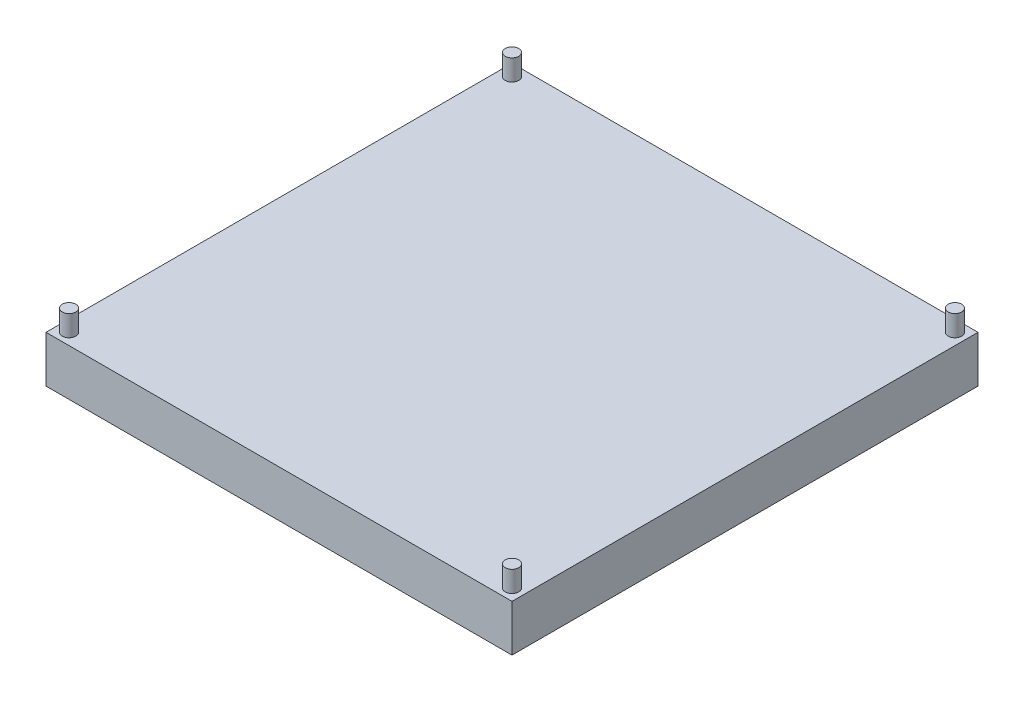
ISO-10303-21;
HEADER;
FILE_DESCRIPTION(('STEP AP214'),'2;1');
FILE_NAME('part.step','',(''),(''),'','','');
FILE_SCHEMA(('AUTOMOTIVE_DESIGN { 1 0 10303 214 1 1 1 1 }'));
ENDSEC;
DATA;
#1=APPLICATION_CONTEXT('core data for automotive mechanical design processes');
#2=APPLICATION_PROTOCOL_DEFINITION('international standard','automotive_design',2000,#1);
#3=PRODUCT_CONTEXT('',#1,'mechanical');
#4=PRODUCT('Part','Part','',(#3));
#5=PRODUCT_RELATED_PRODUCT_CATEGORY('part','',(#4));
#6=PRODUCT_DEFINITION_FORMATION('','',#4);
#7=PRODUCT_DEFINITION_CONTEXT('part definition',#1,'design');
#8=PRODUCT_DEFINITION('design','',#6,#7);
#9=PRODUCT_DEFINITION_SHAPE('','',#8);
#10=(LENGTH_UNIT() NAMED_UNIT(*) SI_UNIT(.MILLI.,.METRE.));
#11=(NAMED_UNIT(*) PLANE_ANGLE_UNIT() SI_UNIT($,.RADIAN.));
#12=(NAMED_UNIT(*) SI_UNIT($,.STERADIAN.) SOLID_ANGLE_UNIT());
#13=UNCERTAINTY_MEASURE_WITH_UNIT(LENGTH_MEASURE(1.E-05),#10,'distance_accuracy_value','');
#14=(GEOMETRIC_REPRESENTATION_CONTEXT(3) GLOBAL_UNCERTAINTY_ASSIGNED_CONTEXT((#13)) GLOBAL_UNIT_ASSIGNED_CONTEXT((#10,
#11,#12)) REPRESENTATION_CONTEXT('',''));
#15=CARTESIAN_POINT('',(0.,0.,0.));
#16=DIRECTION('',(0.,0.,1.));
#17=DIRECTION('',(1.,0.,0.));
#18=AXIS2_PLACEMENT_3D('',#15,#16,#17);
#19=CARTESIAN_POINT('',(25.4,5.08,25.4));
#20=DIRECTION('',(-1.,0.,0.));
#21=DIRECTION('',(0.,0.,1.));
#22=AXIS2_PLACEMENT_3D('',#19,#20,#21);
#23=PLANE('',#22);
#24=DIRECTION('',(0.,0.,-1.));
#25=VECTOR('',#24,1.);
#26=CARTESIAN_POINT('',(25.4,0.,25.4));
#27=LINE('',#26,#25);
#28=CARTESIAN_POINT('',(25.4,0.,25.4));
#29=VERTEX_POINT('',#28);
#30=CARTESIAN_POINT('',(25.4,0.,-25.4));
#31=VERTEX_POINT('',#30);
#32=EDGE_CURVE('E179',#29,#31,#27,.T.);
#33=ORIENTED_EDGE('',*,*,#32,.T.);
#34=DIRECTION('',(0.,-1.,0.));
#35=VECTOR('',#34,1.);
#36=CARTESIAN_POINT('',(25.4,5.08,-25.4));
#37=LINE('',#36,#35);
#38=CARTESIAN_POINT('',(25.4,5.08,-25.4));
#39=VERTEX_POINT('',#38);
#40=EDGE_CURVE('E211',#39,#31,#37,.T.);
#41=ORIENTED_EDGE('',*,*,#40,.F.);
#42=DIRECTION('',(0.,0.,-1.));
#43=VECTOR('',#42,1.);
#44=CARTESIAN_POINT('',(25.4,5.08,25.4));
#45=LINE('',#44,#43);
#46=CARTESIAN_POINT('',(25.4,5.08,25.4));
#47=VERTEX_POINT('',#46);
#48=EDGE_CURVE('E180',#47,#39,#45,.T.);
#49=ORIENTED_EDGE('',*,*,#48,.F.);
#50=DIRECTION('',(0.,-1.,0.));
#51=VECTOR('',#50,1.);
#52=CARTESIAN_POINT('',(25.4,5.08,25.4));
#53=LINE('',#52,#51);
#54=EDGE_CURVE('E190',#47,#29,#53,.T.);
#55=ORIENTED_EDGE('',*,*,#54,.T.);
#56=EDGE_LOOP('',(#33,#41,#49,#55));
#57=FACE_BOUND('',#56,.T.);
#58=ADVANCED_FACE('F38',(#57),#23,.F.);
#59=CARTESIAN_POINT('',(-25.4,5.08,-25.4));
#60=DIRECTION('',(0.,0.,1.));
#61=DIRECTION('',(1.,0.,0.));
#62=AXIS2_PLACEMENT_3D('',#59,#60,#61);
#63=PLANE('',#62);
#64=DIRECTION('',(-1.,0.,0.));
#65=VECTOR('',#64,1.);
#66=CARTESIAN_POINT('',(-25.4,0.,-25.4));
#67=LINE('',#66,#65);
#68=CARTESIAN_POINT('',(-25.4,0.,-25.4));
#69=VERTEX_POINT('',#68);
#70=EDGE_CURVE('E194',#31,#69,#67,.T.);
#71=ORIENTED_EDGE('',*,*,#70,.T.);
#72=DIRECTION('',(0.,-1.,0.));
#73=VECTOR('',#72,1.);
#74=CARTESIAN_POINT('',(-25.4,5.08,-25.4));
#75=LINE('',#74,#73);
#76=CARTESIAN_POINT('',(-25.4,5.08,-25.4));
#77=VERTEX_POINT('',#76);
#78=EDGE_CURVE('E207',#77,#69,#75,.T.);
#79=ORIENTED_EDGE('',*,*,#78,.F.);
#80=DIRECTION('',(-1.,0.,0.));
#81=VECTOR('',#80,1.);
#82=CARTESIAN_POINT('',(-25.4,5.08,-25.4));
#83=LINE('',#82,#81);
#84=EDGE_CURVE('E91',#39,#77,#83,.T.);
#85=ORIENTED_EDGE('',*,*,#84,.F.);
#86=ORIENTED_EDGE('',*,*,#40,.T.);
#87=EDGE_LOOP('',(#71,#79,#85,#86));
#88=FACE_BOUND('',#87,.T.);
#89=ADVANCED_FACE('F241',(#88),#63,.F.);
#90=CARTESIAN_POINT('',(-25.4,5.08,25.4));
#91=DIRECTION('',(1.,0.,0.));
#92=DIRECTION('',(0.,0.,-1.));
#93=AXIS2_PLACEMENT_3D('',#90,#91,#92);
#94=PLANE('',#93);
#95=DIRECTION('',(0.,0.,1.));
#96=VECTOR('',#95,1.);
#97=CARTESIAN_POINT('',(-25.4,0.,25.4));
#98=LINE('',#97,#96);
#99=CARTESIAN_POINT('',(-25.4,0.,25.4));
#100=VERTEX_POINT('',#99);
#101=EDGE_CURVE('E197',#69,#100,#98,.T.);
#102=ORIENTED_EDGE('',*,*,#101,.T.);
#103=DIRECTION('',(0.,-1.,0.));
#104=VECTOR('',#103,1.);
#105=CARTESIAN_POINT('',(-25.4,5.08,25.4));
#106=LINE('',#105,#104);
#107=CARTESIAN_POINT('',(-25.4,5.08,25.4));
#108=VERTEX_POINT('',#107);
#109=EDGE_CURVE('E204',#108,#100,#106,.T.);
#110=ORIENTED_EDGE('',*,*,#109,.F.);
#111=DIRECTION('',(0.,0.,1.));
#112=VECTOR('',#111,1.);
#113=CARTESIAN_POINT('',(-25.4,5.08,25.4));
#114=LINE('',#113,#112);
#115=EDGE_CURVE('E185',#77,#108,#114,.T.);
#116=ORIENTED_EDGE('',*,*,#115,.F.);
#117=ORIENTED_EDGE('',*,*,#78,.T.);
#118=EDGE_LOOP('',(#102,#110,#116,#117));
#119=FACE_BOUND('',#118,.T.);
#120=ADVANCED_FACE('F246',(#119),#94,.F.);
#121=CARTESIAN_POINT('',(-25.4,5.08,25.4));
#122=DIRECTION('',(0.,0.,-1.));
#123=DIRECTION('',(-1.,0.,0.));
#124=AXIS2_PLACEMENT_3D('',#121,#122,#123);
#125=PLANE('',#124);
#126=DIRECTION('',(1.,0.,0.));
#127=VECTOR('',#126,1.);
#128=CARTESIAN_POINT('',(-25.4,0.,25.4));
#129=LINE('',#128,#127);
#130=EDGE_CURVE('E83',#100,#29,#129,.T.);
#131=ORIENTED_EDGE('',*,*,#130,.T.);
#132=ORIENTED_EDGE('',*,*,#54,.F.);
#133=DIRECTION('',(1.,0.,0.));
#134=VECTOR('',#133,1.);
#135=CARTESIAN_POINT('',(-25.4,5.08,25.4));
#136=LINE('',#135,#134);
#137=EDGE_CURVE('E62',#108,#47,#136,.T.);
#138=ORIENTED_EDGE('',*,*,#137,.F.);
#139=ORIENTED_EDGE('',*,*,#109,.T.);
#140=EDGE_LOOP('',(#131,#132,#138,#139));
#141=FACE_BOUND('',#140,.T.);
#142=ADVANCED_FACE('F231',(#141),#125,.F.);
#143=CARTESIAN_POINT('',(0.,5.08,0.));
#144=DIRECTION('',(0.,-1.,0.));
#145=DIRECTION('',(0.,0.,-1.));
#146=AXIS2_PLACEMENT_3D('',#143,#144,#145);
#147=PLANE('',#146);
#148=CARTESIAN_POINT('',(-24.1427641430503,5.08,24.1427641430503));
#149=DIRECTION('',(0.,-1.,0.));
#150=DIRECTION('',(0.,0.,-1.));
#151=AXIS2_PLACEMENT_3D('',#148,#149,#150);
#152=CIRCLE('',#151,0.7366);
#153=CARTESIAN_POINT('',(-24.1427641430503,5.08,23.4061641430503));
#154=VERTEX_POINT('',#153);
#155=EDGE_CURVE('E11',#154,#154,#152,.F.);
#156=ORIENTED_EDGE('',*,*,#155,.F.);
#157=EDGE_LOOP('',(#156));
#158=FACE_BOUND('',#157,.T.);
#159=CARTESIAN_POINT('',(24.1427641430503,5.08,24.1427641430503));
#160=DIRECTION('',(0.,-1.,0.));
#161=DIRECTION('',(0.,0.,-1.));
#162=AXIS2_PLACEMENT_3D('',#159,#160,#161);
#163=CIRCLE('',#162,0.7366);
#164=CARTESIAN_POINT('',(24.1427641430503,5.08,23.4061641430503));
#165=VERTEX_POINT('',#164);
#166=EDGE_CURVE('E46',#165,#165,#163,.F.);
#167=ORIENTED_EDGE('',*,*,#166,.F.);
#168=EDGE_LOOP('',(#167));
#169=FACE_BOUND('',#168,.T.);
#170=CARTESIAN_POINT('',(-24.1427641430503,5.08,-24.1427641430503));
#171=DIRECTION('',(0.,-1.,0.));
#172=DIRECTION('',(0.,0.,-1.));
#173=AXIS2_PLACEMENT_3D('',#170,#171,#172);
#174=CIRCLE('',#173,0.7366);
#175=CARTESIAN_POINT('',(-24.1427641430503,5.08,-24.8793641430503));
#176=VERTEX_POINT('',#175);
#177=EDGE_CURVE('E218',#176,#176,#174,.F.);
#178=ORIENTED_EDGE('',*,*,#177,.F.);
#179=EDGE_LOOP('',(#178));
#180=FACE_BOUND('',#179,.T.);
#181=CARTESIAN_POINT('',(24.1427641430503,5.08,-24.1427641430503));
#182=DIRECTION('',(0.,-1.,0.));
#183=DIRECTION('',(0.,0.,-1.));
#184=AXIS2_PLACEMENT_3D('',#181,#182,#183);
#185=CIRCLE('',#184,0.7366);
#186=CARTESIAN_POINT('',(24.1427641430503,5.08,-24.8793641430503));
#187=VERTEX_POINT('',#186);
#188=EDGE_CURVE('E214',#187,#187,#185,.F.);
#189=ORIENTED_EDGE('',*,*,#188,.F.);
#190=EDGE_LOOP('',(#189));
#191=FACE_BOUND('',#190,.T.);
#192=ORIENTED_EDGE('',*,*,#48,.T.);
#193=ORIENTED_EDGE('',*,*,#84,.T.);
#194=ORIENTED_EDGE('',*,*,#115,.T.);
#195=ORIENTED_EDGE('',*,*,#137,.T.);
#196=EDGE_LOOP('',(#192,#193,#194,#195));
#197=FACE_BOUND('',#196,.T.);
#198=ADVANCED_FACE('F227',(#158,#169,#180,#191,#197),#147,.F.);
#199=CARTESIAN_POINT('',(0.,0.,0.));
#200=DIRECTION('',(0.,-1.,0.));
#201=DIRECTION('',(0.,0.,-1.));
#202=AXIS2_PLACEMENT_3D('',#199,#200,#201);
#203=PLANE('',#202);
#204=DIRECTION('',(0.,0.,1.));
#205=VECTOR('',#204,1.);
#206=CARTESIAN_POINT('',(22.86,0.,-22.86));
#207=LINE('',#206,#205);
#208=CARTESIAN_POINT('',(22.86,0.,-22.86));
#209=VERTEX_POINT('',#208);
#210=CARTESIAN_POINT('',(22.86,0.,22.86));
#211=VERTEX_POINT('',#210);
#212=EDGE_CURVE('E53',#209,#211,#207,.T.);
#213=ORIENTED_EDGE('',*,*,#212,.F.);
#214=DIRECTION('',(1.,0.,0.));
#215=VECTOR('',#214,1.);
#216=CARTESIAN_POINT('',(-22.86,0.,-22.86));
#217=LINE('',#216,#215);
#218=CARTESIAN_POINT('',(-22.86,0.,-22.86));
#219=VERTEX_POINT('',#218);
#220=EDGE_CURVE('E136',#219,#209,#217,.T.);
#221=ORIENTED_EDGE('',*,*,#220,.F.);
#222=DIRECTION('',(0.,0.,-1.));
#223=VECTOR('',#222,1.);
#224=CARTESIAN_POINT('',(-22.86,0.,-22.86));
#225=LINE('',#224,#223);
#226=CARTESIAN_POINT('',(-22.86,0.,22.86));
#227=VERTEX_POINT('',#226);
#228=EDGE_CURVE('E140',#227,#219,#225,.T.);
#229=ORIENTED_EDGE('',*,*,#228,.F.);
#230=DIRECTION('',(-1.,0.,0.));
#231=VECTOR('',#230,1.);
#232=CARTESIAN_POINT('',(-22.86,0.,22.86));
#233=LINE('',#232,#231);
#234=EDGE_CURVE('E149',#211,#227,#233,.T.);
#235=ORIENTED_EDGE('',*,*,#234,.F.);
#236=EDGE_LOOP('',(#213,#221,#229,#235));
#237=FACE_BOUND('',#236,.T.);
#238=ORIENTED_EDGE('',*,*,#32,.F.);
#239=ORIENTED_EDGE('',*,*,#130,.F.);
#240=ORIENTED_EDGE('',*,*,#101,.F.);
#241=ORIENTED_EDGE('',*,*,#70,.F.);
#242=EDGE_LOOP('',(#238,#239,#240,#241));
#243=FACE_BOUND('',#242,.T.);
#244=ADVANCED_FACE('F230',(#237,#243),#203,.T.);
#245=CARTESIAN_POINT('',(24.1427641430503,7.366,-24.1427641430503));
#246=DIRECTION('',(0.,-1.,0.));
#247=DIRECTION('',(0.,0.,-1.));
#248=AXIS2_PLACEMENT_3D('',#245,#246,#247);
#249=CYLINDRICAL_SURFACE('',#248,0.7366);
#250=CARTESIAN_POINT('',(24.1427641430503,7.366,-24.1427641430503));
#251=DIRECTION('',(0.,1.,0.));
#252=DIRECTION('',(0.,0.,-1.));
#253=AXIS2_PLACEMENT_3D('',#250,#251,#252);
#254=CIRCLE('',#253,0.7366);
#255=CARTESIAN_POINT('',(24.1427641430503,7.366,-24.8793641430503));
#256=VERTEX_POINT('',#255);
#257=EDGE_CURVE('E175',#256,#256,#254,.T.);
#258=ORIENTED_EDGE('',*,*,#257,.F.);
#259=EDGE_LOOP('',(#258));
#260=FACE_BOUND('',#259,.T.);
#261=ORIENTED_EDGE('',*,*,#188,.T.);
#262=EDGE_LOOP('',(#261));
#263=FACE_BOUND('',#262,.T.);
#264=ADVANCED_FACE('F249',(#260,#263),#249,.T.);
#265=CARTESIAN_POINT('',(24.1427641430503,7.366,-24.1427641430503));
#266=DIRECTION('',(0.,-1.,0.));
#267=DIRECTION('',(0.,0.,-1.));
#268=AXIS2_PLACEMENT_3D('',#265,#266,#267);
#269=PLANE('',#268);
#270=ORIENTED_EDGE('',*,*,#257,.T.);
#271=EDGE_LOOP('',(#270));
#272=FACE_BOUND('',#271,.T.);
#273=ADVANCED_FACE('F257',(#272),#269,.F.);
#274=CARTESIAN_POINT('',(-24.1427641430503,7.366,-24.1427641430503));
#275=DIRECTION('',(0.,-1.,0.));
#276=DIRECTION('',(0.,0.,-1.));
#277=AXIS2_PLACEMENT_3D('',#274,#275,#276);
#278=CYLINDRICAL_SURFACE('',#277,0.7366);
#279=CARTESIAN_POINT('',(-24.1427641430503,7.366,-24.1427641430503));
#280=DIRECTION('',(0.,1.,0.));
#281=DIRECTION('',(0.,0.,1.));
#282=AXIS2_PLACEMENT_3D('',#279,#280,#281);
#283=CIRCLE('',#282,0.7366);
#284=CARTESIAN_POINT('',(-24.1427641430503,7.366,-23.4061641430503));
#285=VERTEX_POINT('',#284);
#286=EDGE_CURVE('E171',#285,#285,#283,.T.);
#287=ORIENTED_EDGE('',*,*,#286,.F.);
#288=EDGE_LOOP('',(#287));
#289=FACE_BOUND('',#288,.T.);
#290=ORIENTED_EDGE('',*,*,#177,.T.);
#291=EDGE_LOOP('',(#290));
#292=FACE_BOUND('',#291,.T.);
#293=ADVANCED_FACE('F292',(#289,#292),#278,.T.);
#294=CARTESIAN_POINT('',(-24.1427641430503,7.366,-24.1427641430503));
#295=DIRECTION('',(0.,1.,0.));
#296=DIRECTION('',(0.,0.,1.));
#297=AXIS2_PLACEMENT_3D('',#294,#295,#296);
#298=PLANE('',#297);
#299=ORIENTED_EDGE('',*,*,#286,.T.);
#300=EDGE_LOOP('',(#299));
#301=FACE_BOUND('',#300,.T.);
#302=ADVANCED_FACE('F300',(#301),#298,.T.);
#303=CARTESIAN_POINT('',(24.1427641430503,7.366,24.1427641430503));
#304=DIRECTION('',(0.,-1.,0.));
#305=DIRECTION('',(0.,0.,-1.));
#306=AXIS2_PLACEMENT_3D('',#303,#304,#305);
#307=CYLINDRICAL_SURFACE('',#306,0.7366);
#308=CARTESIAN_POINT('',(24.1427641430503,7.366,24.1427641430503));
#309=DIRECTION('',(0.,1.,0.));
#310=DIRECTION('',(0.,0.,1.));
#311=AXIS2_PLACEMENT_3D('',#308,#309,#310);
#312=CIRCLE('',#311,0.7366);
#313=CARTESIAN_POINT('',(24.1427641430503,7.366,24.8793641430503));
#314=VERTEX_POINT('',#313);
#315=EDGE_CURVE('E167',#314,#314,#312,.T.);
#316=ORIENTED_EDGE('',*,*,#315,.F.);
#317=EDGE_LOOP('',(#316));
#318=FACE_BOUND('',#317,.T.);
#319=ORIENTED_EDGE('',*,*,#166,.T.);
#320=EDGE_LOOP('',(#319));
#321=FACE_BOUND('',#320,.T.);
#322=ADVANCED_FACE('F225',(#318,#321),#307,.T.);
#323=CARTESIAN_POINT('',(24.1427641430503,7.366,24.1427641430503));
#324=DIRECTION('',(0.,1.,0.));
#325=DIRECTION('',(0.,0.,1.));
#326=AXIS2_PLACEMENT_3D('',#323,#324,#325);
#327=PLANE('',#326);
#328=ORIENTED_EDGE('',*,*,#315,.T.);
#329=EDGE_LOOP('',(#328));
#330=FACE_BOUND('',#329,.T.);
#331=ADVANCED_FACE('F315',(#330),#327,.T.);
#332=CARTESIAN_POINT('',(-24.1427641430503,7.366,24.1427641430503));
#333=DIRECTION('',(0.,-1.,0.));
#334=DIRECTION('',(0.,0.,-1.));
#335=AXIS2_PLACEMENT_3D('',#332,#333,#334);
#336=CYLINDRICAL_SURFACE('',#335,0.7366);
#337=CARTESIAN_POINT('',(-24.1427641430503,7.366,24.1427641430503));
#338=DIRECTION('',(0.,1.,0.));
#339=DIRECTION('',(0.,0.,-1.));
#340=AXIS2_PLACEMENT_3D('',#337,#338,#339);
#341=CIRCLE('',#340,0.7366);
#342=CARTESIAN_POINT('',(-24.1427641430503,7.366,23.4061641430503));
#343=VERTEX_POINT('',#342);
#344=EDGE_CURVE('E158',#343,#343,#341,.T.);
#345=ORIENTED_EDGE('',*,*,#344,.F.);
#346=EDGE_LOOP('',(#345));
#347=FACE_BOUND('',#346,.T.);
#348=ORIENTED_EDGE('',*,*,#155,.T.);
#349=EDGE_LOOP('',(#348));
#350=FACE_BOUND('',#349,.T.);
#351=ADVANCED_FACE('F323',(#347,#350),#336,.T.);
#352=CARTESIAN_POINT('',(-24.1427641430503,7.366,24.1427641430503));
#353=DIRECTION('',(0.,-1.,0.));
#354=DIRECTION('',(0.,0.,-1.));
#355=AXIS2_PLACEMENT_3D('',#352,#353,#354);
#356=PLANE('',#355);
#357=ORIENTED_EDGE('',*,*,#344,.T.);
#358=EDGE_LOOP('',(#357));
#359=FACE_BOUND('',#358,.T.);
#360=ADVANCED_FACE('F331',(#359),#356,.F.);
#361=CARTESIAN_POINT('',(22.86,1.27,-22.86));
#362=DIRECTION('',(1.,0.,0.));
#363=DIRECTION('',(0.,0.,-1.));
#364=AXIS2_PLACEMENT_3D('',#361,#362,#363);
#365=PLANE('',#364);
#366=ORIENTED_EDGE('',*,*,#212,.T.);
#367=DIRECTION('',(0.,-1.,0.));
#368=VECTOR('',#367,1.);
#369=CARTESIAN_POINT('',(22.86,1.27,22.86));
#370=LINE('',#369,#368);
#371=CARTESIAN_POINT('',(22.86,1.27,22.86));
#372=VERTEX_POINT('',#371);
#373=EDGE_CURVE('E111',#372,#211,#370,.T.);
#374=ORIENTED_EDGE('',*,*,#373,.F.);
#375=DIRECTION('',(0.,0.,1.));
#376=VECTOR('',#375,1.);
#377=CARTESIAN_POINT('',(22.86,1.27,-22.86));
#378=LINE('',#377,#376);
#379=CARTESIAN_POINT('',(22.86,1.27,-22.86));
#380=VERTEX_POINT('',#379);
#381=EDGE_CURVE('E115',#380,#372,#378,.T.);
#382=ORIENTED_EDGE('',*,*,#381,.F.);
#383=DIRECTION('',(0.,-1.,0.));
#384=VECTOR('',#383,1.);
#385=CARTESIAN_POINT('',(22.86,1.27,-22.86));
#386=LINE('',#385,#384);
#387=EDGE_CURVE('E155',#380,#209,#386,.T.);
#388=ORIENTED_EDGE('',*,*,#387,.T.);
#389=EDGE_LOOP('',(#366,#374,#382,#388));
#390=FACE_BOUND('',#389,.T.);
#391=ADVANCED_FACE('F113',(#390),#365,.F.);
#392=CARTESIAN_POINT('',(-22.86,1.27,-22.86));
#393=DIRECTION('',(0.,0.,-1.));
#394=DIRECTION('',(-1.,0.,0.));
#395=AXIS2_PLACEMENT_3D('',#392,#393,#394);
#396=PLANE('',#395);
#397=ORIENTED_EDGE('',*,*,#220,.T.);
#398=ORIENTED_EDGE('',*,*,#387,.F.);
#399=DIRECTION('',(1.,0.,0.));
#400=VECTOR('',#399,1.);
#401=CARTESIAN_POINT('',(-22.86,1.27,-22.86));
#402=LINE('',#401,#400);
#403=CARTESIAN_POINT('',(-22.86,1.27,-22.86));
#404=VERTEX_POINT('',#403);
#405=EDGE_CURVE('E122',#404,#380,#402,.T.);
#406=ORIENTED_EDGE('',*,*,#405,.F.);
#407=DIRECTION('',(0.,-1.,0.));
#408=VECTOR('',#407,1.);
#409=CARTESIAN_POINT('',(-22.86,1.27,-22.86));
#410=LINE('',#409,#408);
#411=EDGE_CURVE('E159',#404,#219,#410,.T.);
#412=ORIENTED_EDGE('',*,*,#411,.T.);
#413=EDGE_LOOP('',(#397,#398,#406,#412));
#414=FACE_BOUND('',#413,.T.);
#415=ADVANCED_FACE('F344',(#414),#396,.F.);
#416=CARTESIAN_POINT('',(-22.86,1.27,-22.86));
#417=DIRECTION('',(-1.,0.,0.));
#418=DIRECTION('',(0.,0.,1.));
#419=AXIS2_PLACEMENT_3D('',#416,#417,#418);
#420=PLANE('',#419);
#421=ORIENTED_EDGE('',*,*,#228,.T.);
#422=ORIENTED_EDGE('',*,*,#411,.F.);
#423=DIRECTION('',(0.,0.,-1.));
#424=VECTOR('',#423,1.);
#425=CARTESIAN_POINT('',(-22.86,1.27,-22.86));
#426=LINE('',#425,#424);
#427=CARTESIAN_POINT('',(-22.86,1.27,22.86));
#428=VERTEX_POINT('',#427);
#429=EDGE_CURVE('E131',#428,#404,#426,.T.);
#430=ORIENTED_EDGE('',*,*,#429,.F.);
#431=DIRECTION('',(0.,-1.,0.));
#432=VECTOR('',#431,1.);
#433=CARTESIAN_POINT('',(-22.86,1.27,22.86));
#434=LINE('',#433,#432);
#435=EDGE_CURVE('E121',#428,#227,#434,.T.);
#436=ORIENTED_EDGE('',*,*,#435,.T.);
#437=EDGE_LOOP('',(#421,#422,#430,#436));
#438=FACE_BOUND('',#437,.T.);
#439=ADVANCED_FACE('F351',(#438),#420,.F.);
#440=CARTESIAN_POINT('',(-22.86,1.27,22.86));
#441=DIRECTION('',(0.,0.,1.));
#442=DIRECTION('',(1.,0.,0.));
#443=AXIS2_PLACEMENT_3D('',#440,#441,#442);
#444=PLANE('',#443);
#445=ORIENTED_EDGE('',*,*,#234,.T.);
#446=ORIENTED_EDGE('',*,*,#435,.F.);
#447=DIRECTION('',(-1.,0.,0.));
#448=VECTOR('',#447,1.);
#449=CARTESIAN_POINT('',(-22.86,1.27,22.86));
#450=LINE('',#449,#448);
#451=EDGE_CURVE('E125',#372,#428,#450,.T.);
#452=ORIENTED_EDGE('',*,*,#451,.F.);
#453=ORIENTED_EDGE('',*,*,#373,.T.);
#454=EDGE_LOOP('',(#445,#446,#452,#453));
#455=FACE_BOUND('',#454,.T.);
#456=ADVANCED_FACE('F126',(#455),#444,.F.);
#457=CARTESIAN_POINT('',(0.,1.27,0.));
#458=DIRECTION('',(0.,1.,0.));
#459=DIRECTION('',(0.,0.,1.));
#460=AXIS2_PLACEMENT_3D('',#457,#458,#459);
#461=PLANE('',#460);
#462=ORIENTED_EDGE('',*,*,#381,.T.);
#463=ORIENTED_EDGE('',*,*,#451,.T.);
#464=ORIENTED_EDGE('',*,*,#429,.T.);
#465=ORIENTED_EDGE('',*,*,#405,.T.);
#466=EDGE_LOOP('',(#462,#463,#464,#465));
#467=FACE_BOUND('',#466,.T.);
#468=ADVANCED_FACE('F133',(#467),#461,.F.);
#469=CLOSED_SHELL('',(#58,#89,#120,#142,#198,#244,#264,#273,#293,#302,#322,#331,#351,#360,#391,
#415,#439,#456,#468));
#470=MANIFOLD_SOLID_BREP('B2',#469);
#471=ADVANCED_BREP_SHAPE_REPRESENTATION('',(#18,#470),#14);
#472=SHAPE_DEFINITION_REPRESENTATION(#9,#471);
ENDSEC;
END-ISO-10303-21;
